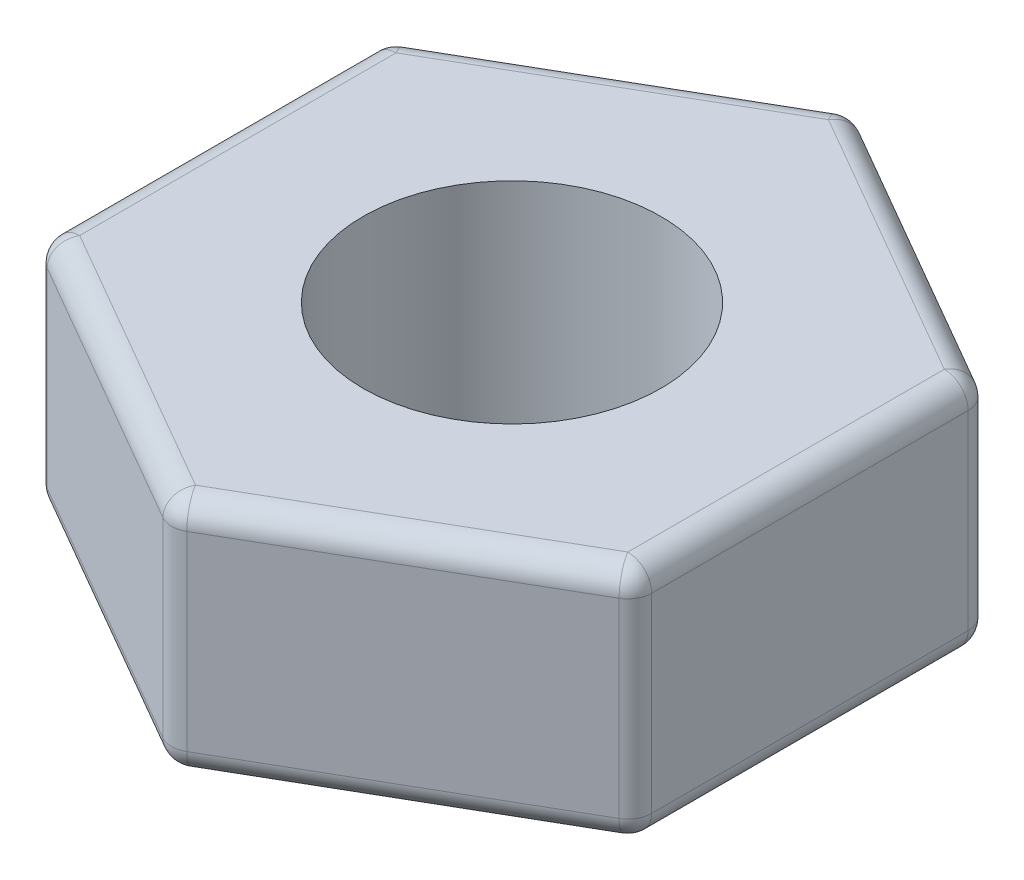
ISO-10303-21;
HEADER;
FILE_DESCRIPTION(('STEP AP214'),'2;1');
FILE_NAME('part.step','',(''),(''),'','','');
FILE_SCHEMA(('AUTOMOTIVE_DESIGN { 1 0 10303 214 1 1 1 1 }'));
ENDSEC;
DATA;
#1=APPLICATION_CONTEXT('core data for automotive mechanical design processes');
#2=APPLICATION_PROTOCOL_DEFINITION('international standard','automotive_design',2000,#1);
#3=PRODUCT_CONTEXT('',#1,'mechanical');
#4=PRODUCT('Part','Part','',(#3));
#5=PRODUCT_RELATED_PRODUCT_CATEGORY('part','',(#4));
#6=PRODUCT_DEFINITION_FORMATION('','',#4);
#7=PRODUCT_DEFINITION_CONTEXT('part definition',#1,'design');
#8=PRODUCT_DEFINITION('design','',#6,#7);
#9=PRODUCT_DEFINITION_SHAPE('','',#8);
#10=(LENGTH_UNIT() NAMED_UNIT(*) SI_UNIT(.MILLI.,.METRE.));
#11=(NAMED_UNIT(*) PLANE_ANGLE_UNIT() SI_UNIT($,.RADIAN.));
#12=(NAMED_UNIT(*) SI_UNIT($,.STERADIAN.) SOLID_ANGLE_UNIT());
#13=UNCERTAINTY_MEASURE_WITH_UNIT(LENGTH_MEASURE(1.E-05),#10,'distance_accuracy_value','');
#14=(GEOMETRIC_REPRESENTATION_CONTEXT(3) GLOBAL_UNCERTAINTY_ASSIGNED_CONTEXT((#13)) GLOBAL_UNIT_ASSIGNED_CONTEXT((#10,
#11,#12)) REPRESENTATION_CONTEXT('',''));
#15=CARTESIAN_POINT('',(0.,0.,0.));
#16=DIRECTION('',(0.,0.,1.));
#17=DIRECTION('',(1.,0.,0.));
#18=AXIS2_PLACEMENT_3D('',#15,#16,#17);
#19=CARTESIAN_POINT('',(0.,2.,0.));
#20=DIRECTION('',(0.,1.,0.));
#21=DIRECTION('',(0.,0.,1.));
#22=AXIS2_PLACEMENT_3D('',#19,#20,#21);
#23=PLANE('',#22);
#24=DIRECTION('',(-0.866025403784442,0.,-0.499999999999995));
#25=VECTOR('',#24,1.);
#26=CARTESIAN_POINT('',(-0.100000000000019,2.,-2.71354626519124));
#27=LINE('',#26,#25);
#28=CARTESIAN_POINT('',(2.3,2.,-1.32790561913615));
#29=VERTEX_POINT('',#28);
#30=CARTESIAN_POINT('',(0.,2.,-2.65581123827228));
#31=VERTEX_POINT('',#30);
#32=EDGE_CURVE('E203',#29,#31,#27,.T.);
#33=ORIENTED_EDGE('',*,*,#32,.T.);
#34=DIRECTION('',(-0.866025403784435,0.,0.500000000000007));
#35=VECTOR('',#34,1.);
#36=CARTESIAN_POINT('',(-2.40000000000001,2.,-1.27017059221716));
#37=LINE('',#36,#35);
#38=CARTESIAN_POINT('',(-2.30000000000001,2.,-1.32790561913612));
#39=VERTEX_POINT('',#38);
#40=EDGE_CURVE('E164',#31,#39,#37,.T.);
#41=ORIENTED_EDGE('',*,*,#40,.T.);
#42=DIRECTION('',(0.,0.,1.));
#43=VECTOR('',#42,1.);
#44=CARTESIAN_POINT('',(-2.29999999999998,2.,1.44337567297409));
#45=LINE('',#44,#43);
#46=CARTESIAN_POINT('',(-2.29999999999999,2.,1.32790561913617));
#47=VERTEX_POINT('',#46);
#48=EDGE_CURVE('E156',#39,#47,#45,.T.);
#49=ORIENTED_EDGE('',*,*,#48,.T.);
#50=DIRECTION('',(0.866025403784442,0.,0.499999999999995));
#51=VECTOR('',#50,1.);
#52=CARTESIAN_POINT('',(0.0999999999999996,2.,2.71354626519124));
#53=LINE('',#52,#51);
#54=CARTESIAN_POINT('',(0.,2.,2.65581123827228));
#55=VERTEX_POINT('',#54);
#56=EDGE_CURVE('E161',#47,#55,#53,.T.);
#57=ORIENTED_EDGE('',*,*,#56,.T.);
#58=DIRECTION('',(0.866025403784438,0.,-0.500000000000001));
#59=VECTOR('',#58,1.);
#60=CARTESIAN_POINT('',(2.40000000000001,2.,1.27017059221717));
#61=LINE('',#60,#59);
#62=CARTESIAN_POINT('',(2.30000000000001,2.,1.32790561913614));
#63=VERTEX_POINT('',#62);
#64=EDGE_CURVE('E167',#55,#63,#61,.T.);
#65=ORIENTED_EDGE('',*,*,#64,.T.);
#66=DIRECTION('',(0.,0.,-1.));
#67=VECTOR('',#66,1.);
#68=CARTESIAN_POINT('',(2.3,2.,-1.44337567297408));
#69=LINE('',#68,#67);
#70=EDGE_CURVE('E201',#63,#29,#69,.T.);
#71=ORIENTED_EDGE('',*,*,#70,.T.);
#72=EDGE_LOOP('',(#33,#41,#49,#57,#65,#71));
#73=FACE_BOUND('',#72,.T.);
#74=CARTESIAN_POINT('',(0.,2.,0.));
#75=DIRECTION('',(0.,1.,0.));
#76=DIRECTION('',(0.,0.,1.));
#77=AXIS2_PLACEMENT_3D('',#74,#75,#76);
#78=CIRCLE('',#77,1.25);
#79=CARTESIAN_POINT('',(0.,2.,1.25));
#80=VERTEX_POINT('',#79);
#81=EDGE_CURVE('E193',#80,#80,#78,.T.);
#82=ORIENTED_EDGE('',*,*,#81,.F.);
#83=EDGE_LOOP('',(#82));
#84=FACE_BOUND('',#83,.T.);
#85=ADVANCED_FACE('F33',(#73,#84),#23,.T.);
#86=CARTESIAN_POINT('',(0.,0.,0.));
#87=DIRECTION('',(0.,1.,0.));
#88=DIRECTION('',(0.,0.,1.));
#89=AXIS2_PLACEMENT_3D('',#86,#87,#88);
#90=PLANE('',#89);
#91=DIRECTION('',(0.,0.,1.));
#92=VECTOR('',#91,1.);
#93=CARTESIAN_POINT('',(-2.3,0.,0.));
#94=LINE('',#93,#92);
#95=CARTESIAN_POINT('',(-2.29999999999999,0.,1.32790561913617));
#96=VERTEX_POINT('',#95);
#97=CARTESIAN_POINT('',(-2.30000000000001,0.,-1.32790561913612));
#98=VERTEX_POINT('',#97);
#99=EDGE_CURVE('E217',#96,#98,#94,.F.);
#100=ORIENTED_EDGE('',*,*,#99,.T.);
#101=DIRECTION('',(-0.866025403784435,0.,0.500000000000007));
#102=VECTOR('',#101,1.);
#103=CARTESIAN_POINT('',(-1.15000000000002,0.,-1.9918584287042));
#104=LINE('',#103,#102);
#105=CARTESIAN_POINT('',(0.,0.,-2.65581123827228));
#106=VERTEX_POINT('',#105);
#107=EDGE_CURVE('E226',#98,#106,#104,.F.);
#108=ORIENTED_EDGE('',*,*,#107,.T.);
#109=DIRECTION('',(-0.866025403784442,0.,-0.499999999999995));
#110=VECTOR('',#109,1.);
#111=CARTESIAN_POINT('',(1.14999999999999,0.,-1.99185842870422));
#112=LINE('',#111,#110);
#113=CARTESIAN_POINT('',(2.3,0.,-1.32790561913615));
#114=VERTEX_POINT('',#113);
#115=EDGE_CURVE('E224',#106,#114,#112,.F.);
#116=ORIENTED_EDGE('',*,*,#115,.T.);
#117=DIRECTION('',(0.,0.,-1.));
#118=VECTOR('',#117,1.);
#119=CARTESIAN_POINT('',(2.3,0.,0.));
#120=LINE('',#119,#118);
#121=CARTESIAN_POINT('',(2.30000000000001,0.,1.32790561913614));
#122=VERTEX_POINT('',#121);
#123=EDGE_CURVE('E222',#114,#122,#120,.F.);
#124=ORIENTED_EDGE('',*,*,#123,.T.);
#125=DIRECTION('',(0.866025403784438,0.,-0.500000000000001));
#126=VECTOR('',#125,1.);
#127=CARTESIAN_POINT('',(1.15,0.,1.99185842870421));
#128=LINE('',#127,#126);
#129=CARTESIAN_POINT('',(0.,0.,2.65581123827228));
#130=VERTEX_POINT('',#129);
#131=EDGE_CURVE('E219',#122,#130,#128,.F.);
#132=ORIENTED_EDGE('',*,*,#131,.T.);
#133=DIRECTION('',(0.866025403784442,0.,0.499999999999995));
#134=VECTOR('',#133,1.);
#135=CARTESIAN_POINT('',(-1.14999999999999,0.,1.99185842870422));
#136=LINE('',#135,#134);
#137=EDGE_CURVE('E215',#130,#96,#136,.F.);
#138=ORIENTED_EDGE('',*,*,#137,.T.);
#139=EDGE_LOOP('',(#100,#108,#116,#124,#132,#138));
#140=FACE_BOUND('',#139,.T.);
#141=CARTESIAN_POINT('',(0.,0.,0.));
#142=DIRECTION('',(0.,1.,0.));
#143=DIRECTION('',(0.,0.,1.));
#144=AXIS2_PLACEMENT_3D('',#141,#142,#143);
#145=CIRCLE('',#144,1.25);
#146=CARTESIAN_POINT('',(0.,0.,1.25));
#147=VERTEX_POINT('',#146);
#148=EDGE_CURVE('E196',#147,#147,#145,.T.);
#149=ORIENTED_EDGE('',*,*,#148,.T.);
#150=EDGE_LOOP('',(#149));
#151=FACE_BOUND('',#150,.T.);
#152=ADVANCED_FACE('F361',(#140,#151),#90,.F.);
#153=CARTESIAN_POINT('',(-2.49999999999998,2.,1.44337567297409));
#154=DIRECTION('',(0.499999999999995,0.,-0.866025403784441));
#155=DIRECTION('',(-0.866025403784442,0.,-0.499999999999995));
#156=AXIS2_PLACEMENT_3D('',#153,#154,#155);
#157=PLANE('',#156);
#158=DIRECTION('',(0.866025403784442,0.,0.499999999999995));
#159=VECTOR('',#158,1.);
#160=CARTESIAN_POINT('',(-2.49999999999999,1.8,1.44337567297409));
#161=LINE('',#160,#159);
#162=CARTESIAN_POINT('',(-0.1,1.8,2.82901631902917));
#163=VERTEX_POINT('',#162);
#164=CARTESIAN_POINT('',(-2.39999999999999,1.8,1.50111069989306));
#165=VERTEX_POINT('',#164);
#166=EDGE_CURVE('E42',#163,#165,#161,.F.);
#167=ORIENTED_EDGE('',*,*,#166,.T.);
#168=DIRECTION('',(0.,-1.,0.));
#169=VECTOR('',#168,1.);
#170=CARTESIAN_POINT('',(-2.39999999999999,2.,1.50111069989306));
#171=LINE('',#170,#169);
#172=CARTESIAN_POINT('',(-2.39999999999999,0.2,1.50111069989306));
#173=VERTEX_POINT('',#172);
#174=EDGE_CURVE('E11',#165,#173,#171,.T.);
#175=ORIENTED_EDGE('',*,*,#174,.T.);
#176=DIRECTION('',(0.866025403784442,0.,0.499999999999995));
#177=VECTOR('',#176,1.);
#178=CARTESIAN_POINT('',(-2.49999999999998,0.2,1.44337567297409));
#179=LINE('',#178,#177);
#180=CARTESIAN_POINT('',(-0.1,0.2,2.82901631902917));
#181=VERTEX_POINT('',#180);
#182=EDGE_CURVE('E262',#173,#181,#179,.T.);
#183=ORIENTED_EDGE('',*,*,#182,.T.);
#184=DIRECTION('',(0.,-1.,0.));
#185=VECTOR('',#184,1.);
#186=CARTESIAN_POINT('',(-0.0999999999999998,2.,2.82901631902917));
#187=LINE('',#186,#185);
#188=EDGE_CURVE('E53',#181,#163,#187,.F.);
#189=ORIENTED_EDGE('',*,*,#188,.T.);
#190=EDGE_LOOP('',(#167,#175,#183,#189));
#191=FACE_BOUND('',#190,.T.);
#192=ADVANCED_FACE('F382',(#191),#157,.F.);
#193=CARTESIAN_POINT('',(0.,2.,2.88675134594813));
#194=DIRECTION('',(-0.500000000000001,0.,-0.866025403784438));
#195=DIRECTION('',(-0.866025403784438,0.,0.500000000000001));
#196=AXIS2_PLACEMENT_3D('',#193,#194,#195);
#197=PLANE('',#196);
#198=DIRECTION('',(0.866025403784438,0.,-0.500000000000001));
#199=VECTOR('',#198,1.);
#200=CARTESIAN_POINT('',(0.,0.2,2.88675134594813));
#201=LINE('',#200,#199);
#202=CARTESIAN_POINT('',(0.0999999999999994,0.2,2.82901631902917));
#203=VERTEX_POINT('',#202);
#204=CARTESIAN_POINT('',(2.40000000000001,0.2,1.50111069989302));
#205=VERTEX_POINT('',#204);
#206=EDGE_CURVE('E208',#203,#205,#201,.T.);
#207=ORIENTED_EDGE('',*,*,#206,.T.);
#208=DIRECTION('',(0.,-1.,0.));
#209=VECTOR('',#208,1.);
#210=CARTESIAN_POINT('',(2.40000000000001,2.,1.50111069989302));
#211=LINE('',#210,#209);
#212=CARTESIAN_POINT('',(2.40000000000001,1.8,1.50111069989302));
#213=VERTEX_POINT('',#212);
#214=EDGE_CURVE('E213',#205,#213,#211,.F.);
#215=ORIENTED_EDGE('',*,*,#214,.T.);
#216=DIRECTION('',(0.866025403784438,0.,-0.500000000000001));
#217=VECTOR('',#216,1.);
#218=CARTESIAN_POINT('',(0.,1.8,2.88675134594813));
#219=LINE('',#218,#217);
#220=CARTESIAN_POINT('',(0.0999999999999994,1.8,2.82901631902917));
#221=VERTEX_POINT('',#220);
#222=EDGE_CURVE('E210',#213,#221,#219,.F.);
#223=ORIENTED_EDGE('',*,*,#222,.T.);
#224=DIRECTION('',(0.,-1.,0.));
#225=VECTOR('',#224,1.);
#226=CARTESIAN_POINT('',(0.0999999999999994,2.,2.82901631902917));
#227=LINE('',#226,#225);
#228=EDGE_CURVE('E206',#221,#203,#227,.T.);
#229=ORIENTED_EDGE('',*,*,#228,.T.);
#230=EDGE_LOOP('',(#207,#215,#223,#229));
#231=FACE_BOUND('',#230,.T.);
#232=ADVANCED_FACE('F396',(#231),#197,.F.);
#233=CARTESIAN_POINT('',(2.50000000000001,2.,1.44337567297406));
#234=DIRECTION('',(-1.,0.,0.));
#235=DIRECTION('',(0.,0.,1.));
#236=AXIS2_PLACEMENT_3D('',#233,#234,#235);
#237=PLANE('',#236);
#238=DIRECTION('',(0.,0.,-1.));
#239=VECTOR('',#238,1.);
#240=CARTESIAN_POINT('',(2.50000000000001,1.8,1.44337567297406));
#241=LINE('',#240,#239);
#242=CARTESIAN_POINT('',(2.5,1.8,-1.32790561913615));
#243=VERTEX_POINT('',#242);
#244=CARTESIAN_POINT('',(2.50000000000001,1.8,1.32790561913613));
#245=VERTEX_POINT('',#244);
#246=EDGE_CURVE('E257',#243,#245,#241,.F.);
#247=ORIENTED_EDGE('',*,*,#246,.T.);
#248=DIRECTION('',(0.,-1.,0.));
#249=VECTOR('',#248,1.);
#250=CARTESIAN_POINT('',(2.50000000000001,2.,1.32790561913613));
#251=LINE('',#250,#249);
#252=CARTESIAN_POINT('',(2.50000000000001,0.2,1.32790561913613));
#253=VERTEX_POINT('',#252);
#254=EDGE_CURVE('E259',#245,#253,#251,.T.);
#255=ORIENTED_EDGE('',*,*,#254,.T.);
#256=DIRECTION('',(0.,0.,-1.));
#257=VECTOR('',#256,1.);
#258=CARTESIAN_POINT('',(2.50000000000001,0.2,1.44337567297406));
#259=LINE('',#258,#257);
#260=CARTESIAN_POINT('',(2.5,0.2,-1.32790561913615));
#261=VERTEX_POINT('',#260);
#262=EDGE_CURVE('E253',#253,#261,#259,.T.);
#263=ORIENTED_EDGE('',*,*,#262,.T.);
#264=DIRECTION('',(0.,-1.,0.));
#265=VECTOR('',#264,1.);
#266=CARTESIAN_POINT('',(2.5,2.,-1.32790561913615));
#267=LINE('',#266,#265);
#268=EDGE_CURVE('E255',#261,#243,#267,.F.);
#269=ORIENTED_EDGE('',*,*,#268,.T.);
#270=EDGE_LOOP('',(#247,#255,#263,#269));
#271=FACE_BOUND('',#270,.T.);
#272=ADVANCED_FACE('F392',(#271),#237,.F.);
#273=CARTESIAN_POINT('',(2.5,2.,-1.44337567297408));
#274=DIRECTION('',(-0.499999999999995,0.,0.866025403784442));
#275=DIRECTION('',(0.866025403784442,0.,0.499999999999995));
#276=AXIS2_PLACEMENT_3D('',#273,#274,#275);
#277=PLANE('',#276);
#278=DIRECTION('',(0.,-1.,0.));
#279=VECTOR('',#278,1.);
#280=CARTESIAN_POINT('',(0.0999999999999807,2.,-2.82901631902917));
#281=LINE('',#280,#279);
#282=CARTESIAN_POINT('',(0.0999999999999805,0.2,-2.82901631902917));
#283=VERTEX_POINT('',#282);
#284=CARTESIAN_POINT('',(0.0999999999999805,1.8,-2.82901631902917));
#285=VERTEX_POINT('',#284);
#286=EDGE_CURVE('E248',#283,#285,#281,.F.);
#287=ORIENTED_EDGE('',*,*,#286,.T.);
#288=DIRECTION('',(-0.866025403784442,0.,-0.499999999999995));
#289=VECTOR('',#288,1.);
#290=CARTESIAN_POINT('',(2.49999999999999,1.8,-1.44337567297408));
#291=LINE('',#290,#289);
#292=CARTESIAN_POINT('',(2.39999999999999,1.8,-1.50111069989304));
#293=VERTEX_POINT('',#292);
#294=EDGE_CURVE('E250',#285,#293,#291,.F.);
#295=ORIENTED_EDGE('',*,*,#294,.T.);
#296=DIRECTION('',(0.,-1.,0.));
#297=VECTOR('',#296,1.);
#298=CARTESIAN_POINT('',(2.39999999999999,2.,-1.50111069989304));
#299=LINE('',#298,#297);
#300=CARTESIAN_POINT('',(2.39999999999999,0.2,-1.50111069989304));
#301=VERTEX_POINT('',#300);
#302=EDGE_CURVE('E244',#293,#301,#299,.T.);
#303=ORIENTED_EDGE('',*,*,#302,.T.);
#304=DIRECTION('',(-0.866025403784442,0.,-0.499999999999995));
#305=VECTOR('',#304,1.);
#306=CARTESIAN_POINT('',(2.5,0.2,-1.44337567297408));
#307=LINE('',#306,#305);
#308=EDGE_CURVE('E246',#301,#283,#307,.T.);
#309=ORIENTED_EDGE('',*,*,#308,.T.);
#310=EDGE_LOOP('',(#287,#295,#303,#309));
#311=FACE_BOUND('',#310,.T.);
#312=ADVANCED_FACE('F388',(#311),#277,.F.);
#313=CARTESIAN_POINT('',(0.,2.,-2.88675134594813));
#314=DIRECTION('',(0.500000000000007,0.,0.866025403784435));
#315=DIRECTION('',(0.866025403784435,0.,-0.500000000000007));
#316=AXIS2_PLACEMENT_3D('',#313,#314,#315);
#317=PLANE('',#316);
#318=DIRECTION('',(0.,-1.,0.));
#319=VECTOR('',#318,1.);
#320=CARTESIAN_POINT('',(-2.40000000000002,2.,-1.50111069989301));
#321=LINE('',#320,#319);
#322=CARTESIAN_POINT('',(-2.40000000000002,0.2,-1.50111069989301));
#323=VERTEX_POINT('',#322);
#324=CARTESIAN_POINT('',(-2.40000000000002,1.8,-1.50111069989301));
#325=VERTEX_POINT('',#324);
#326=EDGE_CURVE('E239',#323,#325,#321,.F.);
#327=ORIENTED_EDGE('',*,*,#326,.T.);
#328=DIRECTION('',(-0.866025403784435,0.,0.500000000000007));
#329=VECTOR('',#328,1.);
#330=CARTESIAN_POINT('',(0.,1.8,-2.88675134594813));
#331=LINE('',#330,#329);
#332=CARTESIAN_POINT('',(-0.10000000000002,1.8,-2.82901631902917));
#333=VERTEX_POINT('',#332);
#334=EDGE_CURVE('E241',#325,#333,#331,.F.);
#335=ORIENTED_EDGE('',*,*,#334,.T.);
#336=DIRECTION('',(0.,-1.,0.));
#337=VECTOR('',#336,1.);
#338=CARTESIAN_POINT('',(-0.10000000000002,2.,-2.82901631902917));
#339=LINE('',#338,#337);
#340=CARTESIAN_POINT('',(-0.10000000000002,0.2,-2.82901631902917));
#341=VERTEX_POINT('',#340);
#342=EDGE_CURVE('E235',#333,#341,#339,.T.);
#343=ORIENTED_EDGE('',*,*,#342,.T.);
#344=DIRECTION('',(-0.866025403784435,0.,0.500000000000007));
#345=VECTOR('',#344,1.);
#346=CARTESIAN_POINT('',(0.,0.2,-2.88675134594813));
#347=LINE('',#346,#345);
#348=EDGE_CURVE('E237',#341,#323,#347,.T.);
#349=ORIENTED_EDGE('',*,*,#348,.T.);
#350=EDGE_LOOP('',(#327,#335,#343,#349));
#351=FACE_BOUND('',#350,.T.);
#352=ADVANCED_FACE('F374',(#351),#317,.F.);
#353=CARTESIAN_POINT('',(-2.50000000000002,2.,-1.44337567297404));
#354=DIRECTION('',(1.,0.,0.));
#355=DIRECTION('',(0.,0.,-1.));
#356=AXIS2_PLACEMENT_3D('',#353,#354,#355);
#357=PLANE('',#356);
#358=DIRECTION('',(0.,0.,1.));
#359=VECTOR('',#358,1.);
#360=CARTESIAN_POINT('',(-2.50000000000002,1.8,-1.44337567297404));
#361=LINE('',#360,#359);
#362=CARTESIAN_POINT('',(-2.49999999999999,1.8,1.32790561913617));
#363=VERTEX_POINT('',#362);
#364=CARTESIAN_POINT('',(-2.50000000000001,1.8,-1.32790561913612));
#365=VERTEX_POINT('',#364);
#366=EDGE_CURVE('E175',#363,#365,#361,.F.);
#367=ORIENTED_EDGE('',*,*,#366,.T.);
#368=DIRECTION('',(0.,-1.,0.));
#369=VECTOR('',#368,1.);
#370=CARTESIAN_POINT('',(-2.50000000000001,2.,-1.32790561913612));
#371=LINE('',#370,#369);
#372=CARTESIAN_POINT('',(-2.50000000000001,0.2,-1.32790561913612));
#373=VERTEX_POINT('',#372);
#374=EDGE_CURVE('E233',#365,#373,#371,.T.);
#375=ORIENTED_EDGE('',*,*,#374,.T.);
#376=DIRECTION('',(0.,0.,1.));
#377=VECTOR('',#376,1.);
#378=CARTESIAN_POINT('',(-2.50000000000002,0.2,-1.44337567297404));
#379=LINE('',#378,#377);
#380=CARTESIAN_POINT('',(-2.49999999999999,0.2,1.32790561913617));
#381=VERTEX_POINT('',#380);
#382=EDGE_CURVE('E230',#373,#381,#379,.T.);
#383=ORIENTED_EDGE('',*,*,#382,.T.);
#384=DIRECTION('',(0.,-1.,0.));
#385=VECTOR('',#384,1.);
#386=CARTESIAN_POINT('',(-2.49999999999999,2.,1.32790561913617));
#387=LINE('',#386,#385);
#388=EDGE_CURVE('E228',#381,#363,#387,.F.);
#389=ORIENTED_EDGE('',*,*,#388,.T.);
#390=EDGE_LOOP('',(#367,#375,#383,#389));
#391=FACE_BOUND('',#390,.T.);
#392=ADVANCED_FACE('F365',(#391),#357,.F.);
#393=CARTESIAN_POINT('',(0.,2.,0.));
#394=DIRECTION('',(0.,-1.,0.));
#395=DIRECTION('',(0.,0.,-1.));
#396=AXIS2_PLACEMENT_3D('',#393,#394,#395);
#397=CYLINDRICAL_SURFACE('',#396,1.25);
#398=ORIENTED_EDGE('',*,*,#81,.T.);
#399=EDGE_LOOP('',(#398));
#400=FACE_BOUND('',#399,.T.);
#401=ORIENTED_EDGE('',*,*,#148,.F.);
#402=EDGE_LOOP('',(#401));
#403=FACE_BOUND('',#402,.T.);
#404=ADVANCED_FACE('F363',(#400,#403),#397,.F.);
#405=CARTESIAN_POINT('',(0.0999999999999812,0.2,-2.71354626519124));
#406=DIRECTION('',(-0.866025403784435,0.,0.500000000000007));
#407=DIRECTION('',(0.500000000000007,0.,0.866025403784435));
#408=AXIS2_PLACEMENT_3D('',#405,#406,#407);
#409=CYLINDRICAL_SURFACE('',#408,0.2);
#410=CARTESIAN_POINT('',(-2.30000000000001,0.2,-1.32790561913612));
#411=DIRECTION('',(-0.866025403784434,0.,0.500000000000008));
#412=DIRECTION('',(0.500000000000008,0.,0.866025403784434));
#413=AXIS2_PLACEMENT_3D('',#410,#411,#412);
#414=CIRCLE('',#413,0.2);
#415=EDGE_CURVE('E37',#323,#98,#414,.T.);
#416=ORIENTED_EDGE('',*,*,#415,.F.);
#417=ORIENTED_EDGE('',*,*,#348,.F.);
#418=CARTESIAN_POINT('',(0.,0.2,-2.65581123827228));
#419=DIRECTION('',(0.866025403784435,0.,-0.500000000000007));
#420=DIRECTION('',(-0.500000000000007,0.,-0.866025403784435));
#421=AXIS2_PLACEMENT_3D('',#418,#419,#420);
#422=CIRCLE('',#421,0.2);
#423=EDGE_CURVE('E347',#106,#341,#422,.T.);
#424=ORIENTED_EDGE('',*,*,#423,.F.);
#425=ORIENTED_EDGE('',*,*,#107,.F.);
#426=EDGE_LOOP('',(#416,#417,#424,#425));
#427=FACE_BOUND('',#426,.T.);
#428=ADVANCED_FACE('F35',(#427),#409,.T.);
#429=CARTESIAN_POINT('',(-2.30000000000001,0.2,-1.32790561913612));
#430=DIRECTION('',(0.,-1.,0.));
#431=DIRECTION('',(0.,0.,-1.));
#432=AXIS2_PLACEMENT_3D('',#429,#430,#431);
#433=SPHERICAL_SURFACE('',#432,0.2);
#434=CARTESIAN_POINT('',(-2.30000000000001,0.2,-1.32790561913612));
#435=DIRECTION('',(0.,-1.,0.));
#436=DIRECTION('',(0.,0.,-1.));
#437=AXIS2_PLACEMENT_3D('',#434,#435,#436);
#438=CIRCLE('',#437,0.2);
#439=EDGE_CURVE('E342',#323,#373,#438,.F.);
#440=ORIENTED_EDGE('',*,*,#439,.F.);
#441=ORIENTED_EDGE('',*,*,#415,.T.);
#442=CARTESIAN_POINT('',(-2.30000000000001,0.2,-1.32790561913612));
#443=DIRECTION('',(0.,0.,-1.));
#444=DIRECTION('',(-1.,0.,0.));
#445=AXIS2_PLACEMENT_3D('',#442,#443,#444);
#446=CIRCLE('',#445,0.2);
#447=EDGE_CURVE('E345',#373,#98,#446,.F.);
#448=ORIENTED_EDGE('',*,*,#447,.F.);
#449=EDGE_LOOP('',(#440,#441,#448));
#450=FACE_BOUND('',#449,.T.);
#451=ADVANCED_FACE('F372',(#450),#433,.T.);
#452=CARTESIAN_POINT('',(0.,0.2,-2.65581123827228));
#453=DIRECTION('',(0.,-1.,0.));
#454=DIRECTION('',(1.,0.,0.));
#455=AXIS2_PLACEMENT_3D('',#452,#453,#454);
#456=SPHERICAL_SURFACE('',#455,0.2);
#457=CARTESIAN_POINT('',(0.,0.2,-2.65581123827228));
#458=DIRECTION('',(-0.866025403784441,0.,-0.499999999999995));
#459=DIRECTION('',(-0.499999999999995,0.,0.866025403784442));
#460=AXIS2_PLACEMENT_3D('',#457,#458,#459);
#461=CIRCLE('',#460,0.2);
#462=EDGE_CURVE('E336',#106,#283,#461,.F.);
#463=ORIENTED_EDGE('',*,*,#462,.F.);
#464=ORIENTED_EDGE('',*,*,#423,.T.);
#465=CARTESIAN_POINT('',(0.,0.2,-2.65581123827228));
#466=DIRECTION('',(0.,-1.,0.));
#467=DIRECTION('',(0.,0.,-1.));
#468=AXIS2_PLACEMENT_3D('',#465,#466,#467);
#469=CIRCLE('',#468,0.2);
#470=EDGE_CURVE('E339',#283,#341,#469,.F.);
#471=ORIENTED_EDGE('',*,*,#470,.F.);
#472=EDGE_LOOP('',(#463,#464,#471));
#473=FACE_BOUND('',#472,.T.);
#474=ADVANCED_FACE('F504',(#473),#456,.T.);
#475=CARTESIAN_POINT('',(-2.30000000000001,0.2,-1.44337567297404));
#476=DIRECTION('',(0.,0.,1.));
#477=DIRECTION('',(1.,0.,0.));
#478=AXIS2_PLACEMENT_3D('',#475,#476,#477);
#479=CYLINDRICAL_SURFACE('',#478,0.2);
#480=ORIENTED_EDGE('',*,*,#447,.T.);
#481=ORIENTED_EDGE('',*,*,#99,.F.);
#482=CARTESIAN_POINT('',(-2.29999999999999,0.2,1.32790561913617));
#483=DIRECTION('',(0.,0.,1.));
#484=DIRECTION('',(1.,0.,0.));
#485=AXIS2_PLACEMENT_3D('',#482,#483,#484);
#486=CIRCLE('',#485,0.2);
#487=EDGE_CURVE('E333',#381,#96,#486,.T.);
#488=ORIENTED_EDGE('',*,*,#487,.F.);
#489=ORIENTED_EDGE('',*,*,#382,.F.);
#490=EDGE_LOOP('',(#480,#481,#488,#489));
#491=FACE_BOUND('',#490,.T.);
#492=ADVANCED_FACE('F500',(#491),#479,.T.);
#493=CARTESIAN_POINT('',(-2.30000000000001,2.,-1.32790561913612));
#494=DIRECTION('',(0.,-1.,0.));
#495=DIRECTION('',(0.,0.,-1.));
#496=AXIS2_PLACEMENT_3D('',#493,#494,#495);
#497=CYLINDRICAL_SURFACE('',#496,0.2);
#498=ORIENTED_EDGE('',*,*,#439,.T.);
#499=ORIENTED_EDGE('',*,*,#374,.F.);
#500=CARTESIAN_POINT('',(-2.30000000000001,1.8,-1.32790561913612));
#501=DIRECTION('',(0.,1.,0.));
#502=DIRECTION('',(0.,0.,1.));
#503=AXIS2_PLACEMENT_3D('',#500,#501,#502);
#504=CIRCLE('',#503,0.2);
#505=EDGE_CURVE('E330',#325,#365,#504,.T.);
#506=ORIENTED_EDGE('',*,*,#505,.F.);
#507=ORIENTED_EDGE('',*,*,#326,.F.);
#508=EDGE_LOOP('',(#498,#499,#506,#507));
#509=FACE_BOUND('',#508,.T.);
#510=ADVANCED_FACE('F496',(#509),#497,.T.);
#511=CARTESIAN_POINT('',(-1.15000000000002,1.8,-1.9918584287042));
#512=DIRECTION('',(0.866025403784435,0.,-0.500000000000007));
#513=DIRECTION('',(-0.500000000000007,0.,-0.866025403784435));
#514=AXIS2_PLACEMENT_3D('',#511,#512,#513);
#515=CYLINDRICAL_SURFACE('',#514,0.2);
#516=CARTESIAN_POINT('',(0.,1.8,-2.65581123827228));
#517=DIRECTION('',(0.866025403784435,0.,-0.500000000000007));
#518=DIRECTION('',(-0.500000000000007,0.,-0.866025403784435));
#519=AXIS2_PLACEMENT_3D('',#516,#517,#518);
#520=CIRCLE('',#519,0.2);
#521=EDGE_CURVE('E324',#333,#31,#520,.T.);
#522=ORIENTED_EDGE('',*,*,#521,.F.);
#523=ORIENTED_EDGE('',*,*,#334,.F.);
#524=CARTESIAN_POINT('',(-2.30000000000001,1.8,-1.32790561913612));
#525=DIRECTION('',(-0.866025403784435,0.,0.500000000000007));
#526=DIRECTION('',(0.500000000000007,0.,0.866025403784435));
#527=AXIS2_PLACEMENT_3D('',#524,#525,#526);
#528=CIRCLE('',#527,0.2);
#529=EDGE_CURVE('E327',#39,#325,#528,.T.);
#530=ORIENTED_EDGE('',*,*,#529,.F.);
#531=ORIENTED_EDGE('',*,*,#40,.F.);
#532=EDGE_LOOP('',(#522,#523,#530,#531));
#533=FACE_BOUND('',#532,.T.);
#534=ADVANCED_FACE('F492',(#533),#515,.T.);
#535=CARTESIAN_POINT('',(0.,2.,-2.65581123827228));
#536=DIRECTION('',(0.,-1.,0.));
#537=DIRECTION('',(0.,0.,-1.));
#538=AXIS2_PLACEMENT_3D('',#535,#536,#537);
#539=CYLINDRICAL_SURFACE('',#538,0.2);
#540=ORIENTED_EDGE('',*,*,#470,.T.);
#541=ORIENTED_EDGE('',*,*,#342,.F.);
#542=CARTESIAN_POINT('',(0.,1.8,-2.65581123827228));
#543=DIRECTION('',(0.,1.,0.));
#544=DIRECTION('',(0.,0.,1.));
#545=AXIS2_PLACEMENT_3D('',#542,#543,#544);
#546=CIRCLE('',#545,0.2);
#547=EDGE_CURVE('E322',#285,#333,#546,.T.);
#548=ORIENTED_EDGE('',*,*,#547,.F.);
#549=ORIENTED_EDGE('',*,*,#286,.F.);
#550=EDGE_LOOP('',(#540,#541,#548,#549));
#551=FACE_BOUND('',#550,.T.);
#552=ADVANCED_FACE('F488',(#551),#539,.T.);
#553=CARTESIAN_POINT('',(2.4,0.2,-1.27017059221719));
#554=DIRECTION('',(-0.866025403784442,0.,-0.499999999999995));
#555=DIRECTION('',(-0.499999999999995,0.,0.866025403784442));
#556=AXIS2_PLACEMENT_3D('',#553,#554,#555);
#557=CYLINDRICAL_SURFACE('',#556,0.2);
#558=ORIENTED_EDGE('',*,*,#462,.T.);
#559=ORIENTED_EDGE('',*,*,#308,.F.);
#560=CARTESIAN_POINT('',(2.3,0.2,-1.32790561913615));
#561=DIRECTION('',(0.866025403784441,0.,0.499999999999995));
#562=DIRECTION('',(0.499999999999995,0.,-0.866025403784442));
#563=AXIS2_PLACEMENT_3D('',#560,#561,#562);
#564=CIRCLE('',#563,0.2);
#565=EDGE_CURVE('E319',#114,#301,#564,.T.);
#566=ORIENTED_EDGE('',*,*,#565,.F.);
#567=ORIENTED_EDGE('',*,*,#115,.F.);
#568=EDGE_LOOP('',(#558,#559,#566,#567));
#569=FACE_BOUND('',#568,.T.);
#570=ADVANCED_FACE('F484',(#569),#557,.T.);
#571=CARTESIAN_POINT('',(-2.29999999999999,0.2,1.32790561913617));
#572=DIRECTION('',(0.,-1.,0.));
#573=DIRECTION('',(0.,0.,-1.));
#574=AXIS2_PLACEMENT_3D('',#571,#572,#573);
#575=SPHERICAL_SURFACE('',#574,0.2);
#576=CARTESIAN_POINT('',(-2.29999999999999,0.2,1.32790561913617));
#577=DIRECTION('',(0.,-1.,0.));
#578=DIRECTION('',(0.,0.,-1.));
#579=AXIS2_PLACEMENT_3D('',#576,#577,#578);
#580=CIRCLE('',#579,0.2);
#581=EDGE_CURVE('E313',#381,#173,#580,.F.);
#582=ORIENTED_EDGE('',*,*,#581,.F.);
#583=ORIENTED_EDGE('',*,*,#487,.T.);
#584=CARTESIAN_POINT('',(-2.29999999999999,0.2,1.32790561913617));
#585=DIRECTION('',(-0.866025403784441,0.,-0.499999999999995));
#586=DIRECTION('',(-0.499999999999995,0.,0.866025403784442));
#587=AXIS2_PLACEMENT_3D('',#584,#585,#586);
#588=CIRCLE('',#587,0.2);
#589=EDGE_CURVE('E316',#173,#96,#588,.F.);
#590=ORIENTED_EDGE('',*,*,#589,.F.);
#591=EDGE_LOOP('',(#582,#583,#590));
#592=FACE_BOUND('',#591,.T.);
#593=ADVANCED_FACE('F480',(#592),#575,.T.);
#594=CARTESIAN_POINT('',(-2.30000000000001,1.8,-1.32790561913612));
#595=DIRECTION('',(0.,1.,0.));
#596=DIRECTION('',(0.,0.,1.));
#597=AXIS2_PLACEMENT_3D('',#594,#595,#596);
#598=SPHERICAL_SURFACE('',#597,0.2);
#599=ORIENTED_EDGE('',*,*,#529,.T.);
#600=ORIENTED_EDGE('',*,*,#505,.T.);
#601=CARTESIAN_POINT('',(-2.30000000000001,1.8,-1.32790561913612));
#602=DIRECTION('',(0.,0.,-1.));
#603=DIRECTION('',(-1.,0.,0.));
#604=AXIS2_PLACEMENT_3D('',#601,#602,#603);
#605=CIRCLE('',#604,0.2);
#606=EDGE_CURVE('E311',#39,#365,#605,.F.);
#607=ORIENTED_EDGE('',*,*,#606,.F.);
#608=EDGE_LOOP('',(#599,#600,#607));
#609=FACE_BOUND('',#608,.T.);
#610=ADVANCED_FACE('F476',(#609),#598,.T.);
#611=CARTESIAN_POINT('',(0.,1.8,-2.65581123827228));
#612=DIRECTION('',(0.,1.,0.));
#613=DIRECTION('',(0.,0.,1.));
#614=AXIS2_PLACEMENT_3D('',#611,#612,#613);
#615=SPHERICAL_SURFACE('',#614,0.2);
#616=ORIENTED_EDGE('',*,*,#547,.T.);
#617=ORIENTED_EDGE('',*,*,#521,.T.);
#618=CARTESIAN_POINT('',(0.,1.8,-2.65581123827228));
#619=DIRECTION('',(-0.866025403784443,0.,-0.499999999999992));
#620=DIRECTION('',(-0.499999999999993,0.,0.866025403784443));
#621=AXIS2_PLACEMENT_3D('',#618,#619,#620);
#622=CIRCLE('',#621,0.2);
#623=EDGE_CURVE('E308',#285,#31,#622,.F.);
#624=ORIENTED_EDGE('',*,*,#623,.F.);
#625=EDGE_LOOP('',(#616,#617,#624));
#626=FACE_BOUND('',#625,.T.);
#627=ADVANCED_FACE('F472',(#626),#615,.T.);
#628=CARTESIAN_POINT('',(2.3,0.2,-1.32790561913615));
#629=DIRECTION('',(0.,-1.,0.));
#630=DIRECTION('',(0.,0.,-1.));
#631=AXIS2_PLACEMENT_3D('',#628,#629,#630);
#632=SPHERICAL_SURFACE('',#631,0.2);
#633=CARTESIAN_POINT('',(2.3,0.2,-1.32790561913615));
#634=DIRECTION('',(0.,0.,-1.));
#635=DIRECTION('',(-1.,0.,0.));
#636=AXIS2_PLACEMENT_3D('',#633,#634,#635);
#637=CIRCLE('',#636,0.2);
#638=EDGE_CURVE('E302',#114,#261,#637,.F.);
#639=ORIENTED_EDGE('',*,*,#638,.F.);
#640=ORIENTED_EDGE('',*,*,#565,.T.);
#641=CARTESIAN_POINT('',(2.3,0.2,-1.32790561913615));
#642=DIRECTION('',(0.,-1.,0.));
#643=DIRECTION('',(0.,0.,-1.));
#644=AXIS2_PLACEMENT_3D('',#641,#642,#643);
#645=CIRCLE('',#644,0.2);
#646=EDGE_CURVE('E305',#261,#301,#645,.F.);
#647=ORIENTED_EDGE('',*,*,#646,.F.);
#648=EDGE_LOOP('',(#639,#640,#647));
#649=FACE_BOUND('',#648,.T.);
#650=ADVANCED_FACE('F468',(#649),#632,.T.);
#651=CARTESIAN_POINT('',(-2.39999999999999,0.2,1.27017059221721));
#652=DIRECTION('',(0.866025403784442,0.,0.499999999999995));
#653=DIRECTION('',(0.499999999999995,0.,-0.866025403784441));
#654=AXIS2_PLACEMENT_3D('',#651,#652,#653);
#655=CYLINDRICAL_SURFACE('',#654,0.2);
#656=ORIENTED_EDGE('',*,*,#589,.T.);
#657=ORIENTED_EDGE('',*,*,#137,.F.);
#658=CARTESIAN_POINT('',(0.,0.2,2.65581123827228));
#659=DIRECTION('',(0.866025403784441,0.,0.499999999999995));
#660=DIRECTION('',(0.499999999999995,0.,-0.866025403784441));
#661=AXIS2_PLACEMENT_3D('',#658,#659,#660);
#662=CIRCLE('',#661,0.2);
#663=EDGE_CURVE('E297',#181,#130,#662,.T.);
#664=ORIENTED_EDGE('',*,*,#663,.F.);
#665=ORIENTED_EDGE('',*,*,#182,.F.);
#666=EDGE_LOOP('',(#656,#657,#664,#665));
#667=FACE_BOUND('',#666,.T.);
#668=ADVANCED_FACE('F464',(#667),#655,.T.);
#669=CARTESIAN_POINT('',(-2.29999999999999,2.,1.32790561913617));
#670=DIRECTION('',(0.,-1.,0.));
#671=DIRECTION('',(0.,0.,-1.));
#672=AXIS2_PLACEMENT_3D('',#669,#670,#671);
#673=CYLINDRICAL_SURFACE('',#672,0.2);
#674=ORIENTED_EDGE('',*,*,#581,.T.);
#675=ORIENTED_EDGE('',*,*,#174,.F.);
#676=CARTESIAN_POINT('',(-2.29999999999999,1.8,1.32790561913617));
#677=DIRECTION('',(0.,1.,0.));
#678=DIRECTION('',(0.,0.,1.));
#679=AXIS2_PLACEMENT_3D('',#676,#677,#678);
#680=CIRCLE('',#679,0.2);
#681=EDGE_CURVE('E179',#363,#165,#680,.T.);
#682=ORIENTED_EDGE('',*,*,#681,.F.);
#683=ORIENTED_EDGE('',*,*,#388,.F.);
#684=EDGE_LOOP('',(#674,#675,#682,#683));
#685=FACE_BOUND('',#684,.T.);
#686=ADVANCED_FACE('F461',(#685),#673,.T.);
#687=CARTESIAN_POINT('',(-2.3,1.8,0.));
#688=DIRECTION('',(0.,0.,-1.));
#689=DIRECTION('',(-1.,0.,0.));
#690=AXIS2_PLACEMENT_3D('',#687,#688,#689);
#691=CYLINDRICAL_SURFACE('',#690,0.2);
#692=ORIENTED_EDGE('',*,*,#606,.T.);
#693=ORIENTED_EDGE('',*,*,#366,.F.);
#694=CARTESIAN_POINT('',(-2.29999999999999,1.8,1.32790561913617));
#695=DIRECTION('',(0.,0.,1.));
#696=DIRECTION('',(1.,0.,0.));
#697=AXIS2_PLACEMENT_3D('',#694,#695,#696);
#698=CIRCLE('',#697,0.2);
#699=EDGE_CURVE('E171',#47,#363,#698,.T.);
#700=ORIENTED_EDGE('',*,*,#699,.F.);
#701=ORIENTED_EDGE('',*,*,#48,.F.);
#702=EDGE_LOOP('',(#692,#693,#700,#701));
#703=FACE_BOUND('',#702,.T.);
#704=ADVANCED_FACE('F173',(#703),#691,.T.);
#705=CARTESIAN_POINT('',(1.14999999999999,1.8,-1.99185842870422));
#706=DIRECTION('',(0.866025403784442,0.,0.499999999999995));
#707=DIRECTION('',(0.499999999999995,0.,-0.866025403784442));
#708=AXIS2_PLACEMENT_3D('',#705,#706,#707);
#709=CYLINDRICAL_SURFACE('',#708,0.2);
#710=ORIENTED_EDGE('',*,*,#623,.T.);
#711=ORIENTED_EDGE('',*,*,#32,.F.);
#712=CARTESIAN_POINT('',(2.3,1.8,-1.32790561913615));
#713=DIRECTION('',(0.866025403784442,0.,0.499999999999995));
#714=DIRECTION('',(0.499999999999995,0.,-0.866025403784442));
#715=AXIS2_PLACEMENT_3D('',#712,#713,#714);
#716=CIRCLE('',#715,0.2);
#717=EDGE_CURVE('E180',#293,#29,#716,.T.);
#718=ORIENTED_EDGE('',*,*,#717,.F.);
#719=ORIENTED_EDGE('',*,*,#294,.F.);
#720=EDGE_LOOP('',(#710,#711,#718,#719));
#721=FACE_BOUND('',#720,.T.);
#722=ADVANCED_FACE('F454',(#721),#709,.T.);
#723=CARTESIAN_POINT('',(2.3,2.,-1.32790561913615));
#724=DIRECTION('',(0.,-1.,0.));
#725=DIRECTION('',(0.,0.,-1.));
#726=AXIS2_PLACEMENT_3D('',#723,#724,#725);
#727=CYLINDRICAL_SURFACE('',#726,0.2);
#728=ORIENTED_EDGE('',*,*,#646,.T.);
#729=ORIENTED_EDGE('',*,*,#302,.F.);
#730=CARTESIAN_POINT('',(2.3,1.8,-1.32790561913615));
#731=DIRECTION('',(0.,1.,0.));
#732=DIRECTION('',(0.,0.,1.));
#733=AXIS2_PLACEMENT_3D('',#730,#731,#732);
#734=CIRCLE('',#733,0.2);
#735=EDGE_CURVE('E292',#243,#293,#734,.T.);
#736=ORIENTED_EDGE('',*,*,#735,.F.);
#737=ORIENTED_EDGE('',*,*,#268,.F.);
#738=EDGE_LOOP('',(#728,#729,#736,#737));
#739=FACE_BOUND('',#738,.T.);
#740=ADVANCED_FACE('F450',(#739),#727,.T.);
#741=CARTESIAN_POINT('',(2.30000000000001,0.2,1.44337567297406));
#742=DIRECTION('',(0.,0.,-1.));
#743=DIRECTION('',(-1.,0.,0.));
#744=AXIS2_PLACEMENT_3D('',#741,#742,#743);
#745=CYLINDRICAL_SURFACE('',#744,0.2);
#746=ORIENTED_EDGE('',*,*,#638,.T.);
#747=ORIENTED_EDGE('',*,*,#262,.F.);
#748=CARTESIAN_POINT('',(2.30000000000001,0.2,1.32790561913614));
#749=DIRECTION('',(0.,0.,1.));
#750=DIRECTION('',(1.,0.,0.));
#751=AXIS2_PLACEMENT_3D('',#748,#749,#750);
#752=CIRCLE('',#751,0.2);
#753=EDGE_CURVE('E289',#122,#253,#752,.T.);
#754=ORIENTED_EDGE('',*,*,#753,.F.);
#755=ORIENTED_EDGE('',*,*,#123,.F.);
#756=EDGE_LOOP('',(#746,#747,#754,#755));
#757=FACE_BOUND('',#756,.T.);
#758=ADVANCED_FACE('F446',(#757),#745,.T.);
#759=CARTESIAN_POINT('',(-0.1,0.2,2.71354626519124));
#760=DIRECTION('',(0.866025403784438,0.,-0.500000000000001));
#761=DIRECTION('',(-0.500000000000001,0.,-0.866025403784438));
#762=AXIS2_PLACEMENT_3D('',#759,#760,#761);
#763=CYLINDRICAL_SURFACE('',#762,0.2);
#764=CARTESIAN_POINT('',(0.,0.2,2.65581123827228));
#765=DIRECTION('',(-0.866025403784437,0.,0.500000000000003));
#766=DIRECTION('',(0.500000000000003,0.,0.866025403784437));
#767=AXIS2_PLACEMENT_3D('',#764,#765,#766);
#768=CIRCLE('',#767,0.2);
#769=EDGE_CURVE('E299',#130,#203,#768,.T.);
#770=ORIENTED_EDGE('',*,*,#769,.F.);
#771=ORIENTED_EDGE('',*,*,#131,.F.);
#772=CARTESIAN_POINT('',(2.30000000000001,0.2,1.32790561913614));
#773=DIRECTION('',(0.866025403784438,0.,-0.500000000000001));
#774=DIRECTION('',(-0.500000000000001,0.,-0.866025403784438));
#775=AXIS2_PLACEMENT_3D('',#772,#773,#774);
#776=CIRCLE('',#775,0.2);
#777=EDGE_CURVE('E286',#205,#122,#776,.T.);
#778=ORIENTED_EDGE('',*,*,#777,.F.);
#779=ORIENTED_EDGE('',*,*,#206,.F.);
#780=EDGE_LOOP('',(#770,#771,#778,#779));
#781=FACE_BOUND('',#780,.T.);
#782=ADVANCED_FACE('F442',(#781),#763,.T.);
#783=CARTESIAN_POINT('',(0.,0.2,2.65581123827228));
#784=DIRECTION('',(0.,-1.,0.));
#785=DIRECTION('',(1.,0.,0.));
#786=AXIS2_PLACEMENT_3D('',#783,#784,#785);
#787=SPHERICAL_SURFACE('',#786,0.2);
#788=ORIENTED_EDGE('',*,*,#663,.T.);
#789=ORIENTED_EDGE('',*,*,#769,.T.);
#790=CARTESIAN_POINT('',(0.,0.2,2.65581123827228));
#791=DIRECTION('',(0.,-1.,0.));
#792=DIRECTION('',(0.,0.,-1.));
#793=AXIS2_PLACEMENT_3D('',#790,#791,#792);
#794=CIRCLE('',#793,0.2);
#795=EDGE_CURVE('E186',#181,#203,#794,.F.);
#796=ORIENTED_EDGE('',*,*,#795,.F.);
#797=EDGE_LOOP('',(#788,#789,#796));
#798=FACE_BOUND('',#797,.T.);
#799=ADVANCED_FACE('F439',(#798),#787,.T.);
#800=CARTESIAN_POINT('',(-2.29999999999999,1.8,1.32790561913617));
#801=DIRECTION('',(0.,1.,0.));
#802=DIRECTION('',(0.,0.,1.));
#803=AXIS2_PLACEMENT_3D('',#800,#801,#802);
#804=SPHERICAL_SURFACE('',#803,0.2);
#805=ORIENTED_EDGE('',*,*,#699,.T.);
#806=ORIENTED_EDGE('',*,*,#681,.T.);
#807=CARTESIAN_POINT('',(-2.29999999999999,1.8,1.32790561913617));
#808=DIRECTION('',(-0.866025403784442,0.,-0.499999999999995));
#809=DIRECTION('',(-0.499999999999995,0.,0.866025403784442));
#810=AXIS2_PLACEMENT_3D('',#807,#808,#809);
#811=CIRCLE('',#810,0.2);
#812=EDGE_CURVE('E183',#47,#165,#811,.F.);
#813=ORIENTED_EDGE('',*,*,#812,.F.);
#814=EDGE_LOOP('',(#805,#806,#813));
#815=FACE_BOUND('',#814,.T.);
#816=ADVANCED_FACE('F184',(#815),#804,.T.);
#817=CARTESIAN_POINT('',(2.3,1.8,-1.32790561913615));
#818=DIRECTION('',(0.,1.,0.));
#819=DIRECTION('',(0.,0.,1.));
#820=AXIS2_PLACEMENT_3D('',#817,#818,#819);
#821=SPHERICAL_SURFACE('',#820,0.2);
#822=ORIENTED_EDGE('',*,*,#735,.T.);
#823=ORIENTED_EDGE('',*,*,#717,.T.);
#824=CARTESIAN_POINT('',(2.3,1.8,-1.32790561913615));
#825=DIRECTION('',(0.,0.,-1.));
#826=DIRECTION('',(-1.,0.,0.));
#827=AXIS2_PLACEMENT_3D('',#824,#825,#826);
#828=CIRCLE('',#827,0.2);
#829=EDGE_CURVE('E187',#243,#29,#828,.F.);
#830=ORIENTED_EDGE('',*,*,#829,.F.);
#831=EDGE_LOOP('',(#822,#823,#830));
#832=FACE_BOUND('',#831,.T.);
#833=ADVANCED_FACE('F432',(#832),#821,.T.);
#834=CARTESIAN_POINT('',(2.30000000000001,0.2,1.32790561913614));
#835=DIRECTION('',(0.,-1.,0.));
#836=DIRECTION('',(0.,0.,-1.));
#837=AXIS2_PLACEMENT_3D('',#834,#835,#836);
#838=SPHERICAL_SURFACE('',#837,0.2);
#839=ORIENTED_EDGE('',*,*,#777,.T.);
#840=ORIENTED_EDGE('',*,*,#753,.T.);
#841=CARTESIAN_POINT('',(2.30000000000001,0.2,1.32790561913614));
#842=DIRECTION('',(0.,-1.,0.));
#843=DIRECTION('',(0.,0.,-1.));
#844=AXIS2_PLACEMENT_3D('',#841,#842,#843);
#845=CIRCLE('',#844,0.2);
#846=EDGE_CURVE('E280',#205,#253,#845,.F.);
#847=ORIENTED_EDGE('',*,*,#846,.F.);
#848=EDGE_LOOP('',(#839,#840,#847));
#849=FACE_BOUND('',#848,.T.);
#850=ADVANCED_FACE('F428',(#849),#838,.T.);
#851=CARTESIAN_POINT('',(0.,2.,2.65581123827228));
#852=DIRECTION('',(0.,-1.,0.));
#853=DIRECTION('',(0.,0.,-1.));
#854=AXIS2_PLACEMENT_3D('',#851,#852,#853);
#855=CYLINDRICAL_SURFACE('',#854,0.2);
#856=ORIENTED_EDGE('',*,*,#795,.T.);
#857=ORIENTED_EDGE('',*,*,#228,.F.);
#858=CARTESIAN_POINT('',(0.,1.8,2.65581123827228));
#859=DIRECTION('',(0.,1.,0.));
#860=DIRECTION('',(0.,0.,1.));
#861=AXIS2_PLACEMENT_3D('',#858,#859,#860);
#862=CIRCLE('',#861,0.2);
#863=EDGE_CURVE('E277',#163,#221,#862,.T.);
#864=ORIENTED_EDGE('',*,*,#863,.F.);
#865=ORIENTED_EDGE('',*,*,#188,.F.);
#866=EDGE_LOOP('',(#856,#857,#864,#865));
#867=FACE_BOUND('',#866,.T.);
#868=ADVANCED_FACE('F425',(#867),#855,.T.);
#869=CARTESIAN_POINT('',(-1.14999999999999,1.8,1.99185842870422));
#870=DIRECTION('',(-0.866025403784442,0.,-0.499999999999995));
#871=DIRECTION('',(-0.499999999999995,0.,0.866025403784441));
#872=AXIS2_PLACEMENT_3D('',#869,#870,#871);
#873=CYLINDRICAL_SURFACE('',#872,0.2);
#874=ORIENTED_EDGE('',*,*,#812,.T.);
#875=ORIENTED_EDGE('',*,*,#166,.F.);
#876=CARTESIAN_POINT('',(0.,1.8,2.65581123827228));
#877=DIRECTION('',(0.86602540378444,0.,0.499999999999997));
#878=DIRECTION('',(0.499999999999997,0.,-0.86602540378444));
#879=AXIS2_PLACEMENT_3D('',#876,#877,#878);
#880=CIRCLE('',#879,0.2);
#881=EDGE_CURVE('E191',#55,#163,#880,.T.);
#882=ORIENTED_EDGE('',*,*,#881,.F.);
#883=ORIENTED_EDGE('',*,*,#56,.F.);
#884=EDGE_LOOP('',(#874,#875,#882,#883));
#885=FACE_BOUND('',#884,.T.);
#886=ADVANCED_FACE('F189',(#885),#873,.T.);
#887=CARTESIAN_POINT('',(2.3,1.8,0.));
#888=DIRECTION('',(0.,0.,1.));
#889=DIRECTION('',(1.,0.,0.));
#890=AXIS2_PLACEMENT_3D('',#887,#888,#889);
#891=CYLINDRICAL_SURFACE('',#890,0.2);
#892=ORIENTED_EDGE('',*,*,#829,.T.);
#893=ORIENTED_EDGE('',*,*,#70,.F.);
#894=CARTESIAN_POINT('',(2.30000000000001,1.8,1.32790561913614));
#895=DIRECTION('',(0.,0.,1.));
#896=DIRECTION('',(1.,0.,0.));
#897=AXIS2_PLACEMENT_3D('',#894,#895,#896);
#898=CIRCLE('',#897,0.2);
#899=EDGE_CURVE('E273',#245,#63,#898,.T.);
#900=ORIENTED_EDGE('',*,*,#899,.F.);
#901=ORIENTED_EDGE('',*,*,#246,.F.);
#902=EDGE_LOOP('',(#892,#893,#900,#901));
#903=FACE_BOUND('',#902,.T.);
#904=ADVANCED_FACE('F418',(#903),#891,.T.);
#905=CARTESIAN_POINT('',(2.30000000000001,2.,1.32790561913614));
#906=DIRECTION('',(0.,-1.,0.));
#907=DIRECTION('',(0.,0.,-1.));
#908=AXIS2_PLACEMENT_3D('',#905,#906,#907);
#909=CYLINDRICAL_SURFACE('',#908,0.2);
#910=ORIENTED_EDGE('',*,*,#846,.T.);
#911=ORIENTED_EDGE('',*,*,#254,.F.);
#912=CARTESIAN_POINT('',(2.30000000000001,1.8,1.32790561913614));
#913=DIRECTION('',(0.,1.,0.));
#914=DIRECTION('',(0.,0.,1.));
#915=AXIS2_PLACEMENT_3D('',#912,#913,#914);
#916=CIRCLE('',#915,0.2);
#917=EDGE_CURVE('E270',#213,#245,#916,.T.);
#918=ORIENTED_EDGE('',*,*,#917,.F.);
#919=ORIENTED_EDGE('',*,*,#214,.F.);
#920=EDGE_LOOP('',(#910,#911,#918,#919));
#921=FACE_BOUND('',#920,.T.);
#922=ADVANCED_FACE('F414',(#921),#909,.T.);
#923=CARTESIAN_POINT('',(0.,1.8,2.65581123827228));
#924=DIRECTION('',(0.,1.,0.));
#925=DIRECTION('',(-1.,0.,0.));
#926=AXIS2_PLACEMENT_3D('',#923,#924,#925);
#927=SPHERICAL_SURFACE('',#926,0.2);
#928=ORIENTED_EDGE('',*,*,#881,.T.);
#929=ORIENTED_EDGE('',*,*,#863,.T.);
#930=CARTESIAN_POINT('',(0.,1.8,2.65581123827228));
#931=DIRECTION('',(-0.866025403784438,0.,0.500000000000001));
#932=DIRECTION('',(0.500000000000001,0.,0.866025403784438));
#933=AXIS2_PLACEMENT_3D('',#930,#931,#932);
#934=CIRCLE('',#933,0.2);
#935=EDGE_CURVE('E268',#55,#221,#934,.F.);
#936=ORIENTED_EDGE('',*,*,#935,.F.);
#937=EDGE_LOOP('',(#928,#929,#936));
#938=FACE_BOUND('',#937,.T.);
#939=ADVANCED_FACE('F410',(#938),#927,.T.);
#940=CARTESIAN_POINT('',(2.30000000000001,1.8,1.32790561913614));
#941=DIRECTION('',(0.,1.,0.));
#942=DIRECTION('',(0.,0.,1.));
#943=AXIS2_PLACEMENT_3D('',#940,#941,#942);
#944=SPHERICAL_SURFACE('',#943,0.2);
#945=ORIENTED_EDGE('',*,*,#917,.T.);
#946=ORIENTED_EDGE('',*,*,#899,.T.);
#947=CARTESIAN_POINT('',(2.30000000000001,1.8,1.32790561913614));
#948=DIRECTION('',(0.866025403784438,0.,-0.500000000000002));
#949=DIRECTION('',(-0.500000000000002,0.,-0.866025403784438));
#950=AXIS2_PLACEMENT_3D('',#947,#948,#949);
#951=CIRCLE('',#950,0.2);
#952=EDGE_CURVE('E266',#213,#63,#951,.F.);
#953=ORIENTED_EDGE('',*,*,#952,.F.);
#954=EDGE_LOOP('',(#945,#946,#953));
#955=FACE_BOUND('',#954,.T.);
#956=ADVANCED_FACE('F406',(#955),#944,.T.);
#957=CARTESIAN_POINT('',(1.15,1.8,1.99185842870421));
#958=DIRECTION('',(-0.866025403784438,0.,0.500000000000001));
#959=DIRECTION('',(0.500000000000001,0.,0.866025403784438));
#960=AXIS2_PLACEMENT_3D('',#957,#958,#959);
#961=CYLINDRICAL_SURFACE('',#960,0.2);
#962=ORIENTED_EDGE('',*,*,#935,.T.);
#963=ORIENTED_EDGE('',*,*,#222,.F.);
#964=ORIENTED_EDGE('',*,*,#952,.T.);
#965=ORIENTED_EDGE('',*,*,#64,.F.);
#966=EDGE_LOOP('',(#962,#963,#964,#965));
#967=FACE_BOUND('',#966,.T.);
#968=ADVANCED_FACE('F403',(#967),#961,.T.);
#969=CLOSED_SHELL('',(#85,#152,#192,#232,#272,#312,#352,#392,#404,#428,#451,#474,#492,#510,#534,
#552,#570,#593,#610,#627,#650,#668,#686,#704,#722,#740,#758,#782,#799,#816,#833,#850,#868,#886,
#904,#922,#939,#956,#968));
#970=MANIFOLD_SOLID_BREP('B2',#969);
#971=ADVANCED_BREP_SHAPE_REPRESENTATION('',(#18,#970),#14);
#972=SHAPE_DEFINITION_REPRESENTATION(#9,#971);
ENDSEC;
END-ISO-10303-21;
